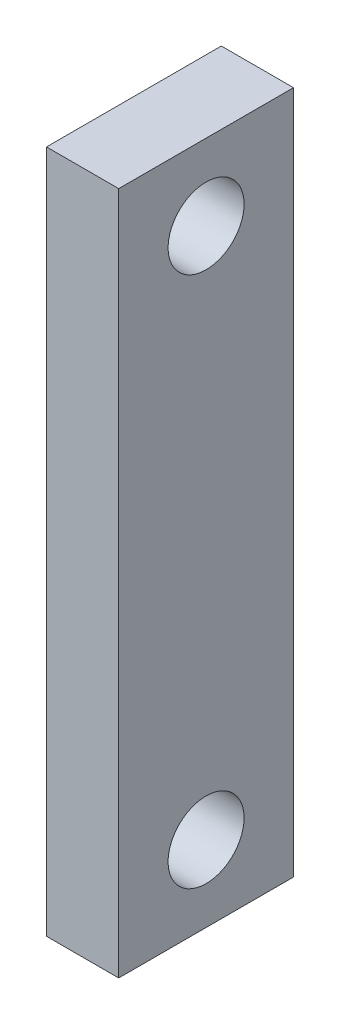
ISO-10303-21;
HEADER;
FILE_DESCRIPTION(('STEP AP214'),'2;1');
FILE_NAME('part.step','',(''),(''),'','','');
FILE_SCHEMA(('AUTOMOTIVE_DESIGN { 1 0 10303 214 1 1 1 1 }'));
ENDSEC;
DATA;
#1=APPLICATION_CONTEXT('core data for automotive mechanical design processes');
#2=APPLICATION_PROTOCOL_DEFINITION('international standard','automotive_design',2000,#1);
#3=PRODUCT_CONTEXT('',#1,'mechanical');
#4=PRODUCT('Part','Part','',(#3));
#5=PRODUCT_RELATED_PRODUCT_CATEGORY('part','',(#4));
#6=PRODUCT_DEFINITION_FORMATION('','',#4);
#7=PRODUCT_DEFINITION_CONTEXT('part definition',#1,'design');
#8=PRODUCT_DEFINITION('design','',#6,#7);
#9=PRODUCT_DEFINITION_SHAPE('','',#8);
#10=(LENGTH_UNIT() NAMED_UNIT(*) SI_UNIT(.MILLI.,.METRE.));
#11=(NAMED_UNIT(*) PLANE_ANGLE_UNIT() SI_UNIT($,.RADIAN.));
#12=(NAMED_UNIT(*) SI_UNIT($,.STERADIAN.) SOLID_ANGLE_UNIT());
#13=UNCERTAINTY_MEASURE_WITH_UNIT(LENGTH_MEASURE(1.E-05),#10,'distance_accuracy_value','');
#14=(GEOMETRIC_REPRESENTATION_CONTEXT(3) GLOBAL_UNCERTAINTY_ASSIGNED_CONTEXT((#13)) GLOBAL_UNIT_ASSIGNED_CONTEXT((#10,
#11,#12)) REPRESENTATION_CONTEXT('',''));
#15=CARTESIAN_POINT('',(0.,0.,0.));
#16=DIRECTION('',(0.,0.,1.));
#17=DIRECTION('',(1.,0.,0.));
#18=AXIS2_PLACEMENT_3D('',#15,#16,#17);
#19=CARTESIAN_POINT('',(35.625,787.126666666667,-86.25));
#20=DIRECTION('',(-1.,0.,0.));
#21=DIRECTION('',(0.,0.,1.));
#22=AXIS2_PLACEMENT_3D('',#19,#20,#21);
#23=PLANE('',#22);
#24=CARTESIAN_POINT('',(35.625,187.446666666667,0.));
#25=DIRECTION('',(1.,0.,0.));
#26=DIRECTION('',(0.,0.,-1.));
#27=AXIS2_PLACEMENT_3D('',#24,#25,#26);
#28=CIRCLE('',#27,37.5);
#29=CARTESIAN_POINT('',(35.625,187.446666666667,-37.5));
#30=VERTEX_POINT('',#29);
#31=EDGE_CURVE('E132',#30,#30,#28,.T.);
#32=ORIENTED_EDGE('',*,*,#31,.F.);
#33=EDGE_LOOP('',(#32));
#34=FACE_BOUND('',#33,.T.);
#35=CARTESIAN_POINT('',(35.625,712.126666666667,0.));
#36=DIRECTION('',(1.,0.,0.));
#37=DIRECTION('',(0.,0.,-1.));
#38=AXIS2_PLACEMENT_3D('',#35,#36,#37);
#39=CIRCLE('',#38,37.5);
#40=CARTESIAN_POINT('',(35.625,712.126666666667,-37.5000000000001));
#41=VERTEX_POINT('',#40);
#42=EDGE_CURVE('E124',#41,#41,#39,.T.);
#43=ORIENTED_EDGE('',*,*,#42,.F.);
#44=EDGE_LOOP('',(#43));
#45=FACE_BOUND('',#44,.T.);
#46=DIRECTION('',(0.,0.,-1.));
#47=VECTOR('',#46,1.);
#48=CARTESIAN_POINT('',(35.625,112.446666666667,-86.25));
#49=LINE('',#48,#47);
#50=CARTESIAN_POINT('',(35.625,112.446666666667,86.25));
#51=VERTEX_POINT('',#50);
#52=CARTESIAN_POINT('',(35.625,112.446666666667,-86.25));
#53=VERTEX_POINT('',#52);
#54=EDGE_CURVE('E111',#51,#53,#49,.T.);
#55=ORIENTED_EDGE('',*,*,#54,.T.);
#56=DIRECTION('',(0.,-1.,0.));
#57=VECTOR('',#56,1.);
#58=CARTESIAN_POINT('',(35.625,787.126666666667,-86.25));
#59=LINE('',#58,#57);
#60=CARTESIAN_POINT('',(35.625,787.126666666667,-86.25));
#61=VERTEX_POINT('',#60);
#62=EDGE_CURVE('E12',#61,#53,#59,.T.);
#63=ORIENTED_EDGE('',*,*,#62,.F.);
#64=DIRECTION('',(0.,0.,-1.));
#65=VECTOR('',#64,1.);
#66=CARTESIAN_POINT('',(35.625,787.126666666667,-86.25));
#67=LINE('',#66,#65);
#68=CARTESIAN_POINT('',(35.625,787.126666666667,86.25));
#69=VERTEX_POINT('',#68);
#70=EDGE_CURVE('E101',#69,#61,#67,.T.);
#71=ORIENTED_EDGE('',*,*,#70,.F.);
#72=DIRECTION('',(0.,-1.,0.));
#73=VECTOR('',#72,1.);
#74=CARTESIAN_POINT('',(35.625,787.126666666667,86.25));
#75=LINE('',#74,#73);
#76=EDGE_CURVE('E109',#69,#51,#75,.T.);
#77=ORIENTED_EDGE('',*,*,#76,.T.);
#78=EDGE_LOOP('',(#55,#63,#71,#77));
#79=FACE_BOUND('',#78,.T.);
#80=ADVANCED_FACE('F48',(#34,#45,#79),#23,.F.);
#81=CARTESIAN_POINT('',(-35.625,787.126666666667,-86.25));
#82=DIRECTION('',(0.,0.,1.));
#83=DIRECTION('',(1.,0.,0.));
#84=AXIS2_PLACEMENT_3D('',#81,#82,#83);
#85=PLANE('',#84);
#86=DIRECTION('',(-1.,0.,0.));
#87=VECTOR('',#86,1.);
#88=CARTESIAN_POINT('',(-35.625,112.446666666667,-86.25));
#89=LINE('',#88,#87);
#90=CARTESIAN_POINT('',(-35.625,112.446666666667,-86.25));
#91=VERTEX_POINT('',#90);
#92=EDGE_CURVE('E104',#53,#91,#89,.T.);
#93=ORIENTED_EDGE('',*,*,#92,.T.);
#94=DIRECTION('',(0.,-1.,0.));
#95=VECTOR('',#94,1.);
#96=CARTESIAN_POINT('',(-35.625,787.126666666667,-86.25));
#97=LINE('',#96,#95);
#98=CARTESIAN_POINT('',(-35.625,787.126666666667,-86.25));
#99=VERTEX_POINT('',#98);
#100=EDGE_CURVE('E60',#99,#91,#97,.T.);
#101=ORIENTED_EDGE('',*,*,#100,.F.);
#102=DIRECTION('',(-1.,0.,0.));
#103=VECTOR('',#102,1.);
#104=CARTESIAN_POINT('',(-35.625,787.126666666667,-86.25));
#105=LINE('',#104,#103);
#106=EDGE_CURVE('E96',#61,#99,#105,.T.);
#107=ORIENTED_EDGE('',*,*,#106,.F.);
#108=ORIENTED_EDGE('',*,*,#62,.T.);
#109=EDGE_LOOP('',(#93,#101,#107,#108));
#110=FACE_BOUND('',#109,.T.);
#111=ADVANCED_FACE('F102',(#110),#85,.F.);
#112=CARTESIAN_POINT('',(-35.625,787.126666666667,-86.25));
#113=DIRECTION('',(1.,0.,0.));
#114=DIRECTION('',(0.,0.,-1.));
#115=AXIS2_PLACEMENT_3D('',#112,#113,#114);
#116=PLANE('',#115);
#117=CARTESIAN_POINT('',(-35.625,187.446666666667,0.));
#118=DIRECTION('',(1.,0.,0.));
#119=DIRECTION('',(0.,0.,-1.));
#120=AXIS2_PLACEMENT_3D('',#117,#118,#119);
#121=CIRCLE('',#120,37.5);
#122=CARTESIAN_POINT('',(-35.625,187.446666666667,-37.5));
#123=VERTEX_POINT('',#122);
#124=EDGE_CURVE('E51',#123,#123,#121,.T.);
#125=ORIENTED_EDGE('',*,*,#124,.T.);
#126=EDGE_LOOP('',(#125));
#127=FACE_BOUND('',#126,.T.);
#128=CARTESIAN_POINT('',(-35.6250000000001,712.126666666667,0.));
#129=DIRECTION('',(1.,0.,0.));
#130=DIRECTION('',(0.,0.,-1.));
#131=AXIS2_PLACEMENT_3D('',#128,#129,#130);
#132=CIRCLE('',#131,37.5);
#133=CARTESIAN_POINT('',(-35.6250000000001,712.126666666667,-37.5));
#134=VERTEX_POINT('',#133);
#135=EDGE_CURVE('E120',#134,#134,#132,.T.);
#136=ORIENTED_EDGE('',*,*,#135,.T.);
#137=EDGE_LOOP('',(#136));
#138=FACE_BOUND('',#137,.T.);
#139=DIRECTION('',(0.,0.,1.));
#140=VECTOR('',#139,1.);
#141=CARTESIAN_POINT('',(-35.625,112.446666666667,-86.25));
#142=LINE('',#141,#140);
#143=CARTESIAN_POINT('',(-35.625,112.446666666667,86.25));
#144=VERTEX_POINT('',#143);
#145=EDGE_CURVE('E84',#91,#144,#142,.T.);
#146=ORIENTED_EDGE('',*,*,#145,.T.);
#147=DIRECTION('',(0.,-1.,0.));
#148=VECTOR('',#147,1.);
#149=CARTESIAN_POINT('',(-35.625,787.126666666667,86.25));
#150=LINE('',#149,#148);
#151=CARTESIAN_POINT('',(-35.625,787.126666666667,86.25));
#152=VERTEX_POINT('',#151);
#153=EDGE_CURVE('E106',#152,#144,#150,.T.);
#154=ORIENTED_EDGE('',*,*,#153,.F.);
#155=DIRECTION('',(0.,0.,1.));
#156=VECTOR('',#155,1.);
#157=CARTESIAN_POINT('',(-35.625,787.126666666667,-86.25));
#158=LINE('',#157,#156);
#159=EDGE_CURVE('E97',#99,#152,#158,.T.);
#160=ORIENTED_EDGE('',*,*,#159,.F.);
#161=ORIENTED_EDGE('',*,*,#100,.T.);
#162=EDGE_LOOP('',(#146,#154,#160,#161));
#163=FACE_BOUND('',#162,.T.);
#164=ADVANCED_FACE('F107',(#127,#138,#163),#116,.F.);
#165=CARTESIAN_POINT('',(-35.625,787.126666666667,86.25));
#166=DIRECTION('',(0.,0.,-1.));
#167=DIRECTION('',(-1.,0.,0.));
#168=AXIS2_PLACEMENT_3D('',#165,#166,#167);
#169=PLANE('',#168);
#170=DIRECTION('',(1.,0.,0.));
#171=VECTOR('',#170,1.);
#172=CARTESIAN_POINT('',(-35.625,112.446666666667,86.25));
#173=LINE('',#172,#171);
#174=EDGE_CURVE('E90',#144,#51,#173,.T.);
#175=ORIENTED_EDGE('',*,*,#174,.T.);
#176=ORIENTED_EDGE('',*,*,#76,.F.);
#177=DIRECTION('',(1.,0.,0.));
#178=VECTOR('',#177,1.);
#179=CARTESIAN_POINT('',(-35.625,787.126666666667,86.25));
#180=LINE('',#179,#178);
#181=EDGE_CURVE('E66',#152,#69,#180,.T.);
#182=ORIENTED_EDGE('',*,*,#181,.F.);
#183=ORIENTED_EDGE('',*,*,#153,.T.);
#184=EDGE_LOOP('',(#175,#176,#182,#183));
#185=FACE_BOUND('',#184,.T.);
#186=ADVANCED_FACE('F155',(#185),#169,.F.);
#187=CARTESIAN_POINT('',(0.,787.126666666667,0.));
#188=DIRECTION('',(0.,1.,0.));
#189=DIRECTION('',(0.,0.,1.));
#190=AXIS2_PLACEMENT_3D('',#187,#188,#189);
#191=PLANE('',#190);
#192=ORIENTED_EDGE('',*,*,#70,.T.);
#193=ORIENTED_EDGE('',*,*,#106,.T.);
#194=ORIENTED_EDGE('',*,*,#159,.T.);
#195=ORIENTED_EDGE('',*,*,#181,.T.);
#196=EDGE_LOOP('',(#192,#193,#194,#195));
#197=FACE_BOUND('',#196,.T.);
#198=ADVANCED_FACE('F100',(#197),#191,.T.);
#199=CARTESIAN_POINT('',(0.,112.446666666667,0.));
#200=DIRECTION('',(0.,1.,0.));
#201=DIRECTION('',(0.,0.,1.));
#202=AXIS2_PLACEMENT_3D('',#199,#200,#201);
#203=PLANE('',#202);
#204=ORIENTED_EDGE('',*,*,#54,.F.);
#205=ORIENTED_EDGE('',*,*,#174,.F.);
#206=ORIENTED_EDGE('',*,*,#145,.F.);
#207=ORIENTED_EDGE('',*,*,#92,.F.);
#208=EDGE_LOOP('',(#204,#205,#206,#207));
#209=FACE_BOUND('',#208,.T.);
#210=ADVANCED_FACE('F145',(#209),#203,.F.);
#211=CARTESIAN_POINT('',(-864.375,712.126666666667,1.04289660398337E-13));
#212=DIRECTION('',(1.,0.,0.));
#213=DIRECTION('',(0.,0.,-1.));
#214=AXIS2_PLACEMENT_3D('',#211,#212,#213);
#215=CYLINDRICAL_SURFACE('',#214,37.5);
#216=ORIENTED_EDGE('',*,*,#42,.T.);
#217=EDGE_LOOP('',(#216));
#218=FACE_BOUND('',#217,.T.);
#219=ORIENTED_EDGE('',*,*,#135,.F.);
#220=EDGE_LOOP('',(#219));
#221=FACE_BOUND('',#220,.T.);
#222=ADVANCED_FACE('F148',(#218,#221),#215,.F.);
#223=CARTESIAN_POINT('',(-133.875,187.446666666667,0.));
#224=DIRECTION('',(1.,0.,0.));
#225=DIRECTION('',(0.,0.,-1.));
#226=AXIS2_PLACEMENT_3D('',#223,#224,#225);
#227=CYLINDRICAL_SURFACE('',#226,37.5);
#228=ORIENTED_EDGE('',*,*,#31,.T.);
#229=EDGE_LOOP('',(#228));
#230=FACE_BOUND('',#229,.T.);
#231=ORIENTED_EDGE('',*,*,#124,.F.);
#232=EDGE_LOOP('',(#231));
#233=FACE_BOUND('',#232,.T.);
#234=ADVANCED_FACE('F136',(#230,#233),#227,.F.);
#235=CLOSED_SHELL('',(#80,#111,#164,#186,#198,#210,#222,#234));
#236=MANIFOLD_SOLID_BREP('B2',#235);
#237=ADVANCED_BREP_SHAPE_REPRESENTATION('',(#18,#236),#14);
#238=SHAPE_DEFINITION_REPRESENTATION(#9,#237);
ENDSEC;
END-ISO-10303-21;
